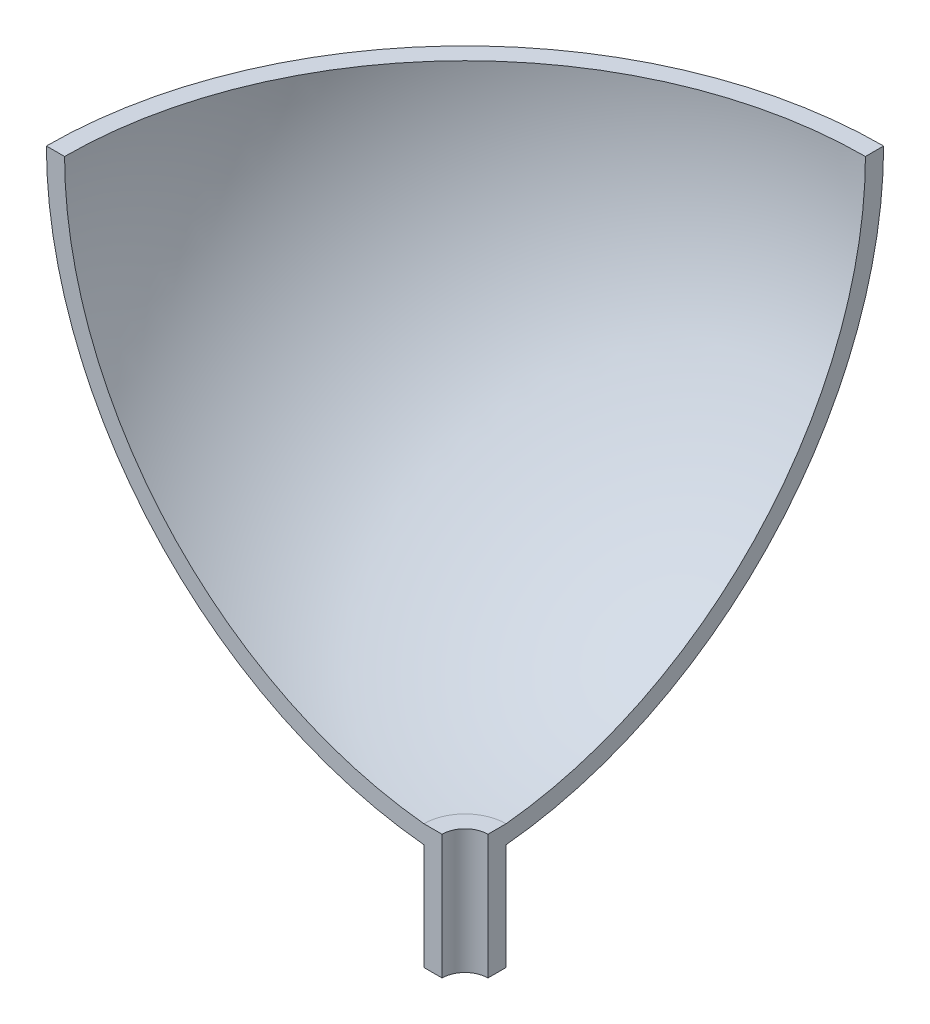
ISO-10303-21;
HEADER;
FILE_DESCRIPTION(('STEP AP214'),'2;1');
FILE_NAME('part.step','',(''),(''),'','','');
FILE_SCHEMA(('AUTOMOTIVE_DESIGN { 1 0 10303 214 1 1 1 1 }'));
ENDSEC;
DATA;
#1=APPLICATION_CONTEXT('core data for automotive mechanical design processes');
#2=APPLICATION_PROTOCOL_DEFINITION('international standard','automotive_design',2000,#1);
#3=PRODUCT_CONTEXT('',#1,'mechanical');
#4=PRODUCT('Part','Part','',(#3));
#5=PRODUCT_RELATED_PRODUCT_CATEGORY('part','',(#4));
#6=PRODUCT_DEFINITION_FORMATION('','',#4);
#7=PRODUCT_DEFINITION_CONTEXT('part definition',#1,'design');
#8=PRODUCT_DEFINITION('design','',#6,#7);
#9=PRODUCT_DEFINITION_SHAPE('','',#8);
#10=(LENGTH_UNIT() NAMED_UNIT(*) SI_UNIT(.MILLI.,.METRE.));
#11=(NAMED_UNIT(*) PLANE_ANGLE_UNIT() SI_UNIT($,.RADIAN.));
#12=(NAMED_UNIT(*) SI_UNIT($,.STERADIAN.) SOLID_ANGLE_UNIT());
#13=UNCERTAINTY_MEASURE_WITH_UNIT(LENGTH_MEASURE(1.E-05),#10,'distance_accuracy_value','');
#14=(GEOMETRIC_REPRESENTATION_CONTEXT(3) GLOBAL_UNCERTAINTY_ASSIGNED_CONTEXT((#13)) GLOBAL_UNIT_ASSIGNED_CONTEXT((#10,
#11,#12)) REPRESENTATION_CONTEXT('',''));
#15=CARTESIAN_POINT('',(0.,0.,0.));
#16=DIRECTION('',(0.,0.,1.));
#17=DIRECTION('',(1.,0.,0.));
#18=AXIS2_PLACEMENT_3D('',#15,#16,#17);
#19=CARTESIAN_POINT('',(-58.9055847390202,-50.2449558000892,-49.712739764208));
#20=CARTESIAN_POINT('',(-57.1857450467342,-50.3220090396217,-51.6724579386181));
#21=CARTESIAN_POINT('',(-55.4133865829986,-50.3653812390935,-53.5796913717649));
#22=CARTESIAN_POINT('',(-53.5740533404874,-50.3658015540345,-55.419993423271));
#23=CARTESIAN_POINT('',(-51.6677180650449,-50.3232525059646,-57.1933368566401));
#24=CARTESIAN_POINT('',(-49.7088412082021,-50.2470077894859,-58.9141727535752));
#25=CARTESIAN_POINT('',(-61.1016903577425,-45.4986884369503,-51.9087872304084));
#26=CARTESIAN_POINT('',(-59.3384090375767,-45.5478819385541,-53.8250919254778));
#27=CARTESIAN_POINT('',(-57.529846001576,-45.5680356274784,-55.696144245559));
#28=CARTESIAN_POINT('',(-55.6905016359395,-45.568448809,-57.5364351811472));
#29=CARTESIAN_POINT('',(-53.8203575703867,-45.5491097019948,-59.3459463738647));
#30=CARTESIAN_POINT('',(-51.9049206041925,-45.5007236093336,-61.1101940140349));
#31=CARTESIAN_POINT('',(-63.0217922628903,-40.5754159406518,-53.8290098230479));
#32=CARTESIAN_POINT('',(-61.2185045999578,-40.5989528018541,-55.7053340979543));
#33=CARTESIAN_POINT('',(-59.3952030568649,-40.6096544751637,-57.5616574609411));
#34=CARTESIAN_POINT('',(-57.5558336286948,-40.6100515837236,-59.4019233502351));
#35=CARTESIAN_POINT('',(-55.7004260500975,-40.6001631967906,-61.2261614812196));
#36=CARTESIAN_POINT('',(-53.8250194995491,-40.5774491828127,-63.0304135988337));
#37=CARTESIAN_POINT('',(-64.6609926945818,-35.4719973076584,-55.4685129558088));
#38=CARTESIAN_POINT('',(-62.857248392138,-35.4952413194044,-57.3443808870892));
#39=CARTESIAN_POINT('',(-61.0338585227858,-35.5058863478193,-59.2006159810486));
#40=CARTESIAN_POINT('',(-59.1945209026759,-35.5063038553436,-61.0409136577925));
#41=CARTESIAN_POINT('',(-57.3392035046148,-35.4964733024796,-62.8652419108795));
#42=CARTESIAN_POINT('',(-55.4642284316629,-35.4740360012622,-64.6699252265088));
#43=CARTESIAN_POINT('',(-66.0151267671325,-30.1857615371508,-56.8231344416957));
#44=CARTESIAN_POINT('',(-64.251774685789,-30.2349096585982,-58.7393684214379));
#45=CARTESIAN_POINT('',(-62.443860089913,-30.2554792014585,-60.6110687614792));
#46=CARTESIAN_POINT('',(-60.6045019640374,-30.2558835583416,-62.4513459457442));
#47=CARTESIAN_POINT('',(-58.7337311862224,-30.2361425317898,-64.2602308322855));
#48=CARTESIAN_POINT('',(-56.8184104928044,-30.1878310065247,-66.0245946698917));
#49=CARTESIAN_POINT('',(-67.096045099094,-24.7243086004753,-57.9047172205054));
#50=CARTESIAN_POINT('',(-65.3762818808082,-24.8014108838791,-59.8645118193635));
#51=CARTESIAN_POINT('',(-63.6018256900255,-24.8434377809617,-61.7696488847114));
#52=CARTESIAN_POINT('',(-61.7624653616699,-24.8438407253629,-63.6099238679236));
#53=CARTESIAN_POINT('',(-59.8582178887083,-24.8026306149158,-65.3853537509562));
#54=CARTESIAN_POINT('',(-57.8993004225248,-24.7263598550855,-67.106149064864));
#55=B_SPLINE_SURFACE_WITH_KNOTS('',5,5,((#19,#20,#21,#22,#23,#24),(#25,#26,#27,#28,#29,#30),
(#31,#32,#33,#34,#35,#36),(#37,#38,#39,#40,#41,#42),(#43,#44,#45,#46,#47,#48),(#49,#50,#51,#52,
#53,#54)),.UNSPECIFIED.,.F.,.F.,.F.,(6,6),(6,6),(-14.0000888690037,14.0266042001397),
(-6.50482985479459,6.5046461084925),.UNSPECIFIED.);
#56=CARTESIAN_POINT('',(-49.9130103250884,-50.0158336792259,-58.9379522964688));
#57=CARTESIAN_POINT('',(-50.0240145074251,-49.7740656418111,-59.0489565312698));
#58=CARTESIAN_POINT('',(-50.1342393521472,-49.5315818055488,-59.1591814225032));
#59=CARTESIAN_POINT('',(-50.3529714141401,-49.0455117182349,-59.3779135667376));
#60=CARTESIAN_POINT('',(-50.4614806748625,-48.8019273062662,-59.4864228632041));
#61=CARTESIAN_POINT('',(-50.6767797655258,-48.3136548694143,-59.7017220157917));
#62=CARTESIAN_POINT('',(-50.7835715268153,-48.0689685478308,-59.8085138032731));
#63=CARTESIAN_POINT('',(-50.9954339105249,-47.5784912882928,-60.0203762310213));
#64=CARTESIAN_POINT('',(-51.1005063483727,-47.3327019187355,-60.1254486867252));
#65=CARTESIAN_POINT('',(-51.3089283794986,-46.840017521427,-60.3338707464214));
#66=CARTESIAN_POINT('',(-51.4122796686318,-46.5931239285273,-60.437222046276));
#67=CARTESIAN_POINT('',(-51.6172577440387,-46.0982300794217,-60.6422001371626));
#68=CARTESIAN_POINT('',(-51.7188861029583,-45.8502311259873,-60.7438285008461));
#69=CARTESIAN_POINT('',(-51.9204167151636,-45.3531255800581,-60.9453591177594));
#70=CARTESIAN_POINT('',(-52.0203204143263,-45.1040201599343,-61.0452628168706));
#71=CARTESIAN_POINT('',(-52.2184001776931,-44.6047007488999,-61.2433425764128));
#72=CARTESIAN_POINT('',(-52.3165775575323,-44.3544878018378,-61.3415199524821));
#73=CARTESIAN_POINT('',(-52.5112032416356,-43.8529524579815,-61.536145626367));
#74=CARTESIAN_POINT('',(-52.6076527279297,-43.6016309786038,-61.6325951062145));
#75=CARTESIAN_POINT('',(-52.798821288963,-43.0978777542658,-61.8237636526531));
#76=CARTESIAN_POINT('',(-52.8935414088931,-42.8454468025967,-61.9184837644361));
#77=CARTESIAN_POINT('',(-53.0812500215578,-42.3394738907946,-62.1061923600058));
#78=CARTESIAN_POINT('',(-53.1742394195611,-42.0859326023563,-62.1991817490618));
#79=CARTESIAN_POINT('',(-53.3584855087849,-41.5777383570756,-62.3834278204042));
#80=CARTESIAN_POINT('',(-53.4497429624418,-41.3230859530847,-62.474685265127));
#81=CARTESIAN_POINT('',(-53.6305242351022,-40.8126689096288,-62.6554665206507));
#82=CARTESIAN_POINT('',(-53.7200486709932,-40.5569047071517,-62.7449909483385));
#83=CARTESIAN_POINT('',(-53.8973631475972,-40.0442636024467,-62.9223054098782));
#84=CARTESIAN_POINT('',(-53.9851536571473,-39.7873870245485,-63.0100959125666));
#85=CARTESIAN_POINT('',(-54.1589997034805,-39.272520817431,-63.183941947012));
#86=CARTESIAN_POINT('',(-54.2450555587851,-39.0145314033123,-63.2699977972901));
#87=CARTESIAN_POINT('',(-54.415431917527,-38.497439294792,-63.4403741481805));
#88=CARTESIAN_POINT('',(-54.4997525871621,-38.2383367099117,-63.5246948149904));
#89=CARTESIAN_POINT('',(-54.6666584094671,-37.7190181634119,-63.6916006340756));
#90=CARTESIAN_POINT('',(-54.7492435742806,-37.4588022095981,-63.7741857984943));
#91=CARTESIAN_POINT('',(-54.9126784513261,-36.9372569711716,-63.9376206772615));
#92=CARTESIAN_POINT('',(-54.9935280202133,-36.6759275967202,-64.0184702482655));
#93=CARTESIAN_POINT('',(-55.1534920147123,-36.1521557152424,-64.1784342494324));
#94=CARTESIAN_POINT('',(-55.2326061403726,-35.8897130250022,-64.2575483796443));
#95=CARTESIAN_POINT('',(-55.3890998180527,-35.3637148723399,-64.4140420686171));
#96=CARTESIAN_POINT('',(-55.4664789127292,-35.1001591377853,-64.4914211700354));
#97=CARTESIAN_POINT('',(-55.6195033737767,-34.5719354289426,-64.6444456463328));
#98=CARTESIAN_POINT('',(-55.6951481249773,-34.307267098234,-64.7200904060422));
#99=CARTESIAN_POINT('',(-55.8447050354469,-33.7768189114731,-64.8696473346847));
#100=CARTESIAN_POINT('',(-55.9186164216479,-33.5110386195039,-64.9435587305502));
#101=CARTESIAN_POINT('',(-56.0647080448347,-32.9783674164434,-65.0896503734117));
#102=CARTESIAN_POINT('',(-56.1368873511633,-32.7114759948746,-65.1618296897506));
#103=CARTESIAN_POINT('',(-56.2795165789487,-32.1765836405624,-65.3044589368839));
#104=CARTESIAN_POINT('',(-56.3499654128586,-31.9085821278443,-65.3749077801311));
#105=CARTESIAN_POINT('',(-56.4891357969873,-31.371470910809,-65.5140781810251));
#106=CARTESIAN_POINT('',(-56.5578561038707,-31.1023605621922,-65.5827984953353));
#107=CARTESIAN_POINT('',(-56.6935718873146,-30.5630332144632,-65.7185142902583));
#108=CARTESIAN_POINT('',(-56.7605659662627,-30.2928155119876,-65.785508373256));
#109=CARTESIAN_POINT('',(-56.8928321140922,-29.7512752291177,-65.9177745241065));
#110=CARTESIAN_POINT('',(-56.9581026330121,-29.4799518916261,-65.9830450419934));
#111=CARTESIAN_POINT('',(-57.0869248649362,-28.9362023525899,-66.1118672648205));
#112=CARTESIAN_POINT('',(-57.1504748779815,-28.6637753455904,-66.1754172697951));
#113=CARTESIAN_POINT('',(-57.2758596944785,-28.1178207330354,-66.3008020609094));
#114=CARTESIAN_POINT('',(-57.3376926507434,-27.8442922790681,-66.362634999853));
#115=CARTESIAN_POINT('',(-57.4596473829756,-27.2961372981332,-66.4845896857172));
#116=CARTESIAN_POINT('',(-57.5197671677502,-27.0215098851977,-66.5447094414322));
#117=CARTESIAN_POINT('',(-57.6382999383982,-26.4711597875789,-66.6632421394926));
#118=CARTESIAN_POINT('',(-57.6967107926083,-26.1954361847567,-66.7216529501575));
#119=CARTESIAN_POINT('',(-57.8118308095484,-25.642896773059,-66.8367728624344));
#120=CARTESIAN_POINT('',(-57.8685377045395,-25.3660800191871,-66.8934796962853));
#121=CARTESIAN_POINT('',(-57.9243582347104,-25.088906429198,-66.9493001550115));
#122=B_SPLINE_CURVE_WITH_KNOTS('',3,(#56,#57,#58,#59,#60,#61,#62,#63,#64,#65,#66,#67,#68,#69,
#70,#71,#72,#73,#74,#75,#76,#77,#78,#79,#80,#81,#82,#83,#84,#85,#86,#87,#88,#89,#90,#91,#92,#93,
#94,#95,#96,#97,#98,#99,#100,#101,#102,#103,#104,#105,#106,#107,#108,#109,#110,#111,#112,#113,
#114,#115,#116,#117,#118,#119,#120,#121),.UNSPECIFIED.,.F.,.F.,(4,2,2,2,2,2,2,2,2,2,2,2,2,2,2,2,
2,2,2,2,2,2,2,2,2,2,2,2,2,2,2,2,4),(0.,0.864786688565944,1.72845107828965,2.5910646772543,
3.45269949736901,4.31342804599675,5.17332331363659,6.03245875763974,6.89090828194839,
7.74874621285289,8.60604727077249,9.46288653807334,10.3193394229469,11.1754816193812,
12.0313890632671,12.8871378846926,13.7428043564863,14.598464839083,15.4541957217939,
16.3100733605735,17.1661740123853,18.0225737662782,18.8793484712952,19.7365736613441,
20.594324477169,21.4526755855705,22.3117010960285,23.1714744748902,24.0320684572916,
24.8935549569866,25.7560049742627,26.6194885021167,27.4840744309083),.UNSPECIFIED.);
#123=CARTESIAN_POINT('',(-49.9128168842235,-50.015709622826,-58.9377589809462));
#124=VERTEX_POINT('',#123);
#125=CARTESIAN_POINT('',(-57.9241253788509,-25.0887570949897,-66.9490674500338));
#126=VERTEX_POINT('',#125);
#127=EDGE_CURVE('E131',#124,#126,#122,.T.);
#128=CARTESIAN_POINT('',(-57.9243582348084,-25.0889064287122,-66.9493001551093));
#129=CARTESIAN_POINT('',(-58.1252942163154,-25.0887050982726,-66.7747300820743));
#130=CARTESIAN_POINT('',(-58.3255285439231,-25.0885630825879,-66.5993514342258));
#131=CARTESIAN_POINT('',(-58.7244597536622,-25.088368261401,-66.2470096548569));
#132=CARTESIAN_POINT('',(-58.9231572027319,-25.0883154212708,-66.0700471652075));
#133=CARTESIAN_POINT('',(-59.3189716812076,-25.0882694287908,-65.7144932161497));
#134=CARTESIAN_POINT('',(-59.5160892082541,-25.0882762568426,-65.5359023108515));
#135=CARTESIAN_POINT('',(-59.908705319142,-25.0883245460424,-65.1770558973588));
#136=CARTESIAN_POINT('',(-60.1042043273546,-25.0883659978017,-64.9968008535206));
#137=CARTESIAN_POINT('',(-60.493549063474,-25.0884622927992,-64.6345975260028));
#138=CARTESIAN_POINT('',(-60.6873951385027,-25.0885171331503,-64.4526496154962));
#139=CARTESIAN_POINT('',(-61.0734049906311,-25.0886233864266,-64.0870397068258));
#140=CARTESIAN_POINT('',(-61.2655690334307,-25.0886747999019,-63.9033779892094));
#141=CARTESIAN_POINT('',(-61.6481917462828,-25.0887619874963,-63.5343273548842));
#142=CARTESIAN_POINT('',(-61.8386505966893,-25.0887977632888,-63.3489386251727));
#143=CARTESIAN_POINT('',(-62.2178464108267,-25.0888462779537,-62.9764286231511));
#144=CARTESIAN_POINT('',(-62.406583466168,-25.088859018059,-62.7893074440981));
#145=CARTESIAN_POINT('',(-62.7823262098473,-25.0888589853955,-62.413334829901));
#146=CARTESIAN_POINT('',(-62.9693318984264,-25.0888462126303,-62.2244833949979));
#147=CARTESIAN_POINT('',(-63.3416098249436,-25.0887976386681,-61.8450599440906));
#148=CARTESIAN_POINT('',(-63.5268819700546,-25.0887618362449,-61.6544878370102));
#149=CARTESIAN_POINT('',(-63.8956983609199,-25.0886746067217,-61.2716397390136));
#150=CARTESIAN_POINT('',(-64.0792424200554,-25.0886231779536,-61.0793635683283));
#151=CARTESIAN_POINT('',(-64.4446159599143,-25.0885169093392,-60.6931305872817));
#152=CARTESIAN_POINT('',(-64.6264451604165,-25.0884620689461,-60.4991735118541));
#153=CARTESIAN_POINT('',(-64.9884100393402,-25.088365791075,-60.109607892405));
#154=CARTESIAN_POINT('',(-65.1685453448611,-25.0883243564841,-59.9139990019397));
#155=CARTESIAN_POINT('',(-65.5271512760949,-25.0882761183599,-59.521164225846));
#156=CARTESIAN_POINT('',(-65.705621437667,-25.0882693242106,-59.3239379165634));
#157=CARTESIAN_POINT('',(-66.0609329155872,-25.0883153983034,-58.9279069463786));
#158=CARTESIAN_POINT('',(-66.2377736779789,-25.0883682861324,-58.7291017885849));
#159=CARTESIAN_POINT('',(-66.5898710388328,-25.088563210336,-58.3299561971163));
#160=CARTESIAN_POINT('',(-66.7651269955091,-25.0887052813186,-58.1296151972756));
#161=CARTESIAN_POINT('',(-66.9395739542035,-25.0889066677563,-57.9285730419037));
#162=B_SPLINE_CURVE_WITH_KNOTS('',3,(#128,#129,#130,#131,#132,#133,#134,#135,#136,#137,#138,
#139,#140,#141,#142,#143,#144,#145,#146,#147,#148,#149,#150,#151,#152,#153,#154,#155,#156,#157,
#158,#159,#160,#161),.UNSPECIFIED.,.F.,.F.,(4,2,2,2,2,2,2,2,2,2,2,2,2,2,2,2,4),(0.,
0.798528704072951,1.59674725920317,2.39470364656522,3.19244372753969,3.99001193670427,
4.78745179908138,5.58480629738741,6.38211812106641,7.17942983372785,7.97678399897745,
8.77422330635641,9.57179073908994,10.3695298235914,11.1674849972731,11.9657021263599,
12.7642291993522),.UNSPECIFIED.);
#163=CARTESIAN_POINT('',(-66.9393409118987,-25.0887572143967,-57.9283401506017));
#164=VERTEX_POINT('',#163);
#165=EDGE_CURVE('E14',#126,#164,#162,.T.);
#166=CARTESIAN_POINT('',(-66.9395739542012,-25.0889066677668,-57.9285730419017));
#167=CARTESIAN_POINT('',(-66.8837504963645,-25.3660811144671,-57.87274965568));
#168=CARTESIAN_POINT('',(-66.8270407077765,-25.6428987217692,-57.8160399283543));
#169=CARTESIAN_POINT('',(-66.7119149269729,-26.1954398550985,-57.7009142523853));
#170=CARTESIAN_POINT('',(-66.6535012022088,-26.4711643260468,-57.6425005712159));
#171=CARTESIAN_POINT('',(-66.5349626742303,-27.0215161500228,-57.5239621158766));
#172=CARTESIAN_POINT('',(-66.4748400024922,-27.2961444211504,-57.4638394732001));
#173=CARTESIAN_POINT('',(-66.35287945009,-27.8443010890465,-57.3418789671413));
#174=CARTESIAN_POINT('',(-66.2910435604966,-28.1178303717682,-57.2800430948428));
#175=CARTESIAN_POINT('',(-66.1656528070015,-28.663786596935,-57.1546523666635));
#176=CARTESIAN_POINT('',(-66.1020997902039,-28.9362143877914,-57.0910993578964));
#177=CARTESIAN_POINT('',(-65.9732714622387,-29.4799654378893,-56.9622710389455));
#178=CARTESIAN_POINT('',(-65.907997850965,-29.7512895025909,-56.8969974286621));
#179=CARTESIAN_POINT('',(-65.7757254166671,-30.2928311746856,-56.7647249912634));
#180=CARTESIAN_POINT('',(-65.7087281435402,-30.5630495391788,-56.6977277140498));
#181=CARTESIAN_POINT('',(-65.5730058610824,-31.1023781399834,-56.5620054200495));
#182=CARTESIAN_POINT('',(-65.5042822492881,-31.3714890796522,-56.4932818008021));
#183=CARTESIAN_POINT('',(-65.3651051394422,-31.9086014044211,-56.3541046741515));
#184=CARTESIAN_POINT('',(-65.2946528846294,-32.1766034338008,-56.2836524099886));
#185=CARTESIAN_POINT('',(-65.1520166969411,-32.7114967456114,-56.141016202941));
#186=CARTESIAN_POINT('',(-65.0798338514895,-32.9783886079788,-56.0688333474804));
#187=CARTESIAN_POINT('',(-64.9337350322079,-33.5110606169377,-55.9227345085407));
#188=CARTESIAN_POINT('',(-64.8598199888822,-33.7768412739472,-55.8488194555655));
#189=CARTESIAN_POINT('',(-64.7102556484634,-34.3072901164431,-55.6992550970155));
#190=CARTESIAN_POINT('',(-64.6346071242543,-34.5719587377637,-55.6236065643242));
#191=CARTESIAN_POINT('',(-64.4815750050236,-35.1001829557353,-55.4705744299056));
#192=CARTESIAN_POINT('',(-64.4041920249579,-35.3637389086998,-55.3931914431335));
#193=CARTESIAN_POINT('',(-64.2476904687738,-35.8897374289263,-55.2366898757326));
#194=CARTESIAN_POINT('',(-64.168572349755,-36.1521802681896,-55.1575717522028));
#195=CARTESIAN_POINT('',(-64.0086002657163,-36.6759523816017,-54.9975996615789));
#196=CARTESIAN_POINT('',(-63.9277466003776,-36.9372818388088,-54.9167459941656));
#197=CARTESIAN_POINT('',(-63.7643034325632,-37.4588271798208,-54.7533028247112));
#198=CARTESIAN_POINT('',(-63.6817140731383,-37.7190431532849,-54.6707134657209));
#199=CARTESIAN_POINT('',(-63.5147997683818,-38.2383616791469,-54.5037991642578));
#200=CARTESIAN_POINT('',(-63.4304748105918,-38.4974642235365,-54.4194742093268));
#201=CARTESIAN_POINT('',(-63.2600897862903,-39.0145561937075,-54.2490891929352));
#202=CARTESIAN_POINT('',(-63.1740295532479,-39.2725455097427,-54.1630289649441));
#203=CARTESIAN_POINT('',(-63.0001746652058,-39.787411465284,-53.9891740888275));
#204=CARTESIAN_POINT('',(-62.9123796913354,-40.0442878894425,-53.9013791218317));
#205=CARTESIAN_POINT('',(-62.7350562016412,-40.5569286324313,-53.7240556472146));
#206=CARTESIAN_POINT('',(-62.6455272166163,-40.8126926266633,-53.6345266703923));
#207=CARTESIAN_POINT('',(-62.4647367615549,-41.3231091996266,-53.4537362324527));
#208=CARTESIAN_POINT('',(-62.3734746742522,-41.577761341079,-53.3624741540693));
#209=CARTESIAN_POINT('',(-62.1892192322503,-42.0859550064477,-53.1782187299055));
#210=CARTESIAN_POINT('',(-62.0962251147205,-42.339495977198,-53.0852246212946));
#211=CARTESIAN_POINT('',(-61.9085069743255,-42.8454681967796,-52.8975064979248));
#212=CARTESIAN_POINT('',(-61.8137820457802,-43.0978987735761,-52.8027815774855));
#213=CARTESIAN_POINT('',(-61.622603773676,-43.6016511880533,-52.6116033198841));
#214=CARTESIAN_POINT('',(-61.5261493844951,-43.8529722320739,-52.5151489370988));
#215=CARTESIAN_POINT('',(-61.3315137935413,-44.3545066405011,-52.3205133562561));
#216=CARTESIAN_POINT('',(-61.233331409283,-44.6047190870894,-52.2223309757113));
#217=CARTESIAN_POINT('',(-61.0352415266247,-45.1040374264912,-52.0242410967644));
#218=CARTESIAN_POINT('',(-60.9353327121044,-45.3531422750157,-51.9243322822391));
#219=CARTESIAN_POINT('',(-60.7337917471777,-45.8502465996979,-51.722791312498));
#220=CARTESIAN_POINT('',(-60.6321581503735,-46.098244902999,-51.62115771088));
#221=CARTESIAN_POINT('',(-60.4271694634589,-46.5931373650284,-51.4161690084014));
#222=CARTESIAN_POINT('',(-60.3238128001388,-46.8400302204467,-51.312812334325));
#223=CARTESIAN_POINT('',(-60.1153798690256,-47.3327130458551,-51.1043793745971));
#224=CARTESIAN_POINT('',(-60.0103019047619,-47.5785015803932,-50.9993013924674));
#225=CARTESIAN_POINT('',(-59.7984282986307,-48.0689770614588,-50.7874277423138));
#226=CARTESIAN_POINT('',(-59.6916308406592,-48.3136624389162,-50.6806302581766));
#227=CARTESIAN_POINT('',(-59.47632016714,-48.80193286643,-50.4653195228333));
#228=CARTESIAN_POINT('',(-59.3678050194977,-49.0455162124301,-50.3568043395211));
#229=CARTESIAN_POINT('',(-59.1490609721757,-49.5315840324149,-50.138060210168));
#230=CARTESIAN_POINT('',(-59.0388300282189,-49.774066666464,-50.0278292198362));
#231=CARTESIAN_POINT('',(-58.9278196574995,-50.0158333763347,-49.9168187968265));
#232=B_SPLINE_CURVE_WITH_KNOTS('',3,(#166,#167,#168,#169,#170,#171,#172,#173,#174,#175,#176,
#177,#178,#179,#180,#181,#182,#183,#184,#185,#186,#187,#188,#189,#190,#191,#192,#193,#194,#195,
#196,#197,#198,#199,#200,#201,#202,#203,#204,#205,#206,#207,#208,#209,#210,#211,#212,#213,#214,
#215,#216,#217,#218,#219,#220,#221,#222,#223,#224,#225,#226,#227,#228,#229,#230,#231),
.UNSPECIFIED.,.F.,.F.,(4,2,2,2,2,2,2,2,2,2,2,2,2,2,2,2,2,2,2,2,2,2,2,2,2,2,2,2,2,2,2,2,4),(0.,
0.864591804058777,1.72808132221831,2.59053742086477,3.45203007770357,4.31263028482108,
5.17240995345081,6.03144182062855,6.8897993579154,7.74755668236354,8.60478846989276,
9.46156987124003,10.317976430637,11.1740840073626,12.0299687003106,12.8857067757012,
13.7413745980611,14.5970485645809,15.4528050429561,16.3087203128016,17.1648705107252,
18.0213315791307,18.878179218816,19.7354888454159,20.5933355497351,21.4517940620024,
22.3109387200703,23.1708434415731,24.0315817000495,24.8932265050241,25.7558503860338,
26.6195253805714,27.4843230259441),.UNSPECIFIED.);
#233=CARTESIAN_POINT('',(-58.9276264527723,-50.0157094713795,-49.9166257172888));
#234=VERTEX_POINT('',#233);
#235=EDGE_CURVE('E118',#164,#234,#232,.T.);
#236=CARTESIAN_POINT('',(-58.9278196574988,-50.015833376336,-49.9168187968261));
#237=CARTESIAN_POINT('',(-58.755419853302,-50.0156764598829,-50.1199626618818));
#238=CARTESIAN_POINT('',(-58.5820478483884,-50.0155670912133,-50.3222822737349));
#239=CARTESIAN_POINT('',(-58.2334401729591,-50.0154178259842,-50.7250952049181));
#240=CARTESIAN_POINT('',(-58.058205694256,-50.0153778874063,-50.925589555739));
#241=CARTESIAN_POINT('',(-57.7058442394387,-50.0153417412332,-51.3247080130437));
#242=CARTESIAN_POINT('',(-57.5287183831371,-50.0153455090555,-51.5233331079744));
#243=CARTESIAN_POINT('',(-57.1725525676258,-50.0153773671623,-51.9186802818867));
#244=CARTESIAN_POINT('',(-56.9935136077286,-50.0154054453083,-52.1154032610732));
#245=CARTESIAN_POINT('',(-56.6335034865665,-50.0154704542231,-52.5069212779928));
#246=CARTESIAN_POINT('',(-56.4525331661686,-50.0155073812785,-52.7017170888631));
#247=CARTESIAN_POINT('',(-56.0886463083522,-50.0155786033999,-53.0893631306769));
#248=CARTESIAN_POINT('',(-55.9057304238637,-50.0156128993191,-53.2822139744993));
#249=CARTESIAN_POINT('',(-55.5379421325703,-50.015670881668,-53.6659586291862));
#250=CARTESIAN_POINT('',(-55.3530701702477,-50.0156945704572,-53.8568528660356));
#251=CARTESIAN_POINT('',(-54.9813632083336,-50.0157266573174,-54.2366782802713));
#252=CARTESIAN_POINT('',(-54.7945284329278,-50.0157350571159,-54.4256096770478));
#253=CARTESIAN_POINT('',(-54.4188932748963,-50.0157350236548,-54.8015081550276));
#254=CARTESIAN_POINT('',(-54.2300928927166,-50.0157265903989,-54.9884752366769));
#255=CARTESIAN_POINT('',(-53.8505282261638,-50.0156944407285,-55.3604481097784));
#256=CARTESIAN_POINT('',(-53.6597637231261,-50.0156707225938,-55.5454536780993));
#257=CARTESIAN_POINT('',(-53.2762772682446,-50.0156126898675,-55.9135104851121));
#258=CARTESIAN_POINT('',(-53.083554890977,-50.015578372923,-56.0965612805294));
#259=CARTESIAN_POINT('',(-52.6961645307997,-50.0155071214466,-56.4607192657093));
#260=CARTESIAN_POINT('',(-52.5014959354155,-50.0154701860668,-56.6418258038885));
#261=CARTESIAN_POINT('',(-52.1102311169627,-50.0154051777895,-57.0021096642214));
#262=CARTESIAN_POINT('',(-51.9136341210179,-50.0153771086088,-57.1812861469735));
#263=CARTESIAN_POINT('',(-51.5185377028253,-50.0153452904743,-57.5377283054294));
#264=CARTESIAN_POINT('',(-51.3200373805092,-50.0153415536592,-57.7149929833797));
#265=CARTESIAN_POINT('',(-50.9211672816214,-50.0153777887332,-58.0676333674061));
#266=CARTESIAN_POINT('',(-50.7207965166387,-50.0154177852003,-58.2430079552921));
#267=CARTESIAN_POINT('',(-50.3182295983568,-50.0155671976074,-58.5918971158469));
#268=CARTESIAN_POINT('',(-50.1160324135306,-50.0156766555536,-58.7654104983503));
#269=CARTESIAN_POINT('',(-49.9130103250929,-50.0158336792162,-58.9379522964732));
#270=B_SPLINE_CURVE_WITH_KNOTS('',3,(#236,#237,#238,#239,#240,#241,#242,#243,#244,#245,#246,
#247,#248,#249,#250,#251,#252,#253,#254,#255,#256,#257,#258,#259,#260,#261,#262,#263,#264,#265,
#266,#267,#268,#269),.UNSPECIFIED.,.F.,.F.,(4,2,2,2,2,2,2,2,2,2,2,2,2,2,2,2,4),(0.,
0.799311481699423,1.59813905757843,2.39651735507522,3.19449723480012,3.9921428213249,
4.78952867273285,5.58673706639499,6.38385537471945,7.1809735021336,7.97818135304152,
8.77556629978626,9.57321061965204,10.3711888706665,11.1695651774913,11.9683904011893,
12.7676991703865),.UNSPECIFIED.);
#271=EDGE_CURVE('E134',#234,#124,#270,.T.);
#272=ORIENTED_EDGE('',*,*,#127,.T.);
#273=ORIENTED_EDGE('',*,*,#165,.T.);
#274=ORIENTED_EDGE('',*,*,#235,.T.);
#275=ORIENTED_EDGE('',*,*,#271,.T.);
#276=EDGE_LOOP('',(#272,#273,#274,#275));
#277=FACE_BOUND('',#276,.T.);
#278=ADVANCED_FACE('F67',(#277),#55,.F.);
#279=CARTESIAN_POINT('',(-57.9238925229428,-25.0886077610243,-66.9488347450076));
#280=DIRECTION('',(-0.707106781186533,0.,0.707106781186562));
#281=DIRECTION('',(0.707106781186562,0.,0.707106781186533));
#282=AXIS2_PLACEMENT_3D('',#279,#280,#281);
#283=PLANE('',#282);
#284=DIRECTION('',(0.,-1.,0.));
#285=VECTOR('',#284,1.);
#286=CARTESIAN_POINT('',(-49.9126234433572,-50.0155855664309,-58.9375656654223));
#287=LINE('',#286,#285);
#288=CARTESIAN_POINT('',(-49.9126234433572,-155.088757094989,-58.9375656654223));
#289=VERTEX_POINT('',#288);
#290=EDGE_CURVE('E126',#124,#289,#287,.T.);
#291=ORIENTED_EDGE('',*,*,#290,.T.);
#292=DIRECTION('',(-0.707106781186562,0.,-0.707106781186533));
#293=VECTOR('',#292,1.);
#294=CARTESIAN_POINT('',(-57.9238925229428,-155.088757094989,-66.9488347450076));
#295=LINE('',#294,#293);
#296=CARTESIAN_POINT('',(-57.9240179132122,-155.08875709499,-66.9489433373106));
#297=VERTEX_POINT('',#296);
#298=EDGE_CURVE('E112',#289,#297,#295,.T.);
#299=ORIENTED_EDGE('',*,*,#298,.T.);
#300=DIRECTION('',(0.,-1.,0.));
#301=VECTOR('',#300,1.);
#302=CARTESIAN_POINT('',(-57.9238925229428,-25.0886077610243,-66.9488347450076));
#303=LINE('',#302,#301);
#304=EDGE_CURVE('E123',#126,#297,#303,.T.);
#305=ORIENTED_EDGE('',*,*,#304,.F.);
#306=ORIENTED_EDGE('',*,*,#127,.F.);
#307=EDGE_LOOP('',(#291,#299,#305,#306));
#308=FACE_BOUND('',#307,.T.);
#309=ADVANCED_FACE('F122',(#308),#283,.F.);
#310=CARTESIAN_POINT('',(0.0451473242549794,-50.0155855664309,0.));
#311=DIRECTION('',(0.,-1.,0.));
#312=DIRECTION('',(0.,0.,-1.));
#313=AXIS2_PLACEMENT_3D('',#310,#311,#312);
#314=CYLINDRICAL_SURFACE('',#313,77.2619926395589);
#315=DIRECTION('',(0.,-1.,0.));
#316=VECTOR('',#315,1.);
#317=CARTESIAN_POINT('',(-58.9274332480463,-50.01558556642,-49.916432637752));
#318=LINE('',#317,#316);
#319=CARTESIAN_POINT('',(-58.9274332480463,-155.088757094989,-49.916432637752));
#320=VERTEX_POINT('',#319);
#321=EDGE_CURVE('E130',#234,#320,#318,.T.);
#322=ORIENTED_EDGE('',*,*,#321,.T.);
#323=CARTESIAN_POINT('',(0.0451473242549794,-155.088757094989,0.));
#324=DIRECTION('',(0.,1.,0.));
#325=DIRECTION('',(0.,0.,1.));
#326=AXIS2_PLACEMENT_3D('',#323,#324,#325);
#327=CIRCLE('',#326,77.2619926395589);
#328=EDGE_CURVE('E127',#320,#289,#327,.F.);
#329=ORIENTED_EDGE('',*,*,#328,.T.);
#330=ORIENTED_EDGE('',*,*,#290,.F.);
#331=ORIENTED_EDGE('',*,*,#271,.F.);
#332=EDGE_LOOP('',(#322,#329,#330,#331));
#333=FACE_BOUND('',#332,.T.);
#334=ADVANCED_FACE('F162',(#333),#314,.F.);
#335=CARTESIAN_POINT('',(-58.9274332480463,-50.01558556642,-49.916432637752));
#336=DIRECTION('',(0.707106781186549,0.,-0.707106781186546));
#337=DIRECTION('',(-0.707106781186546,0.,-0.707106781186549));
#338=AXIS2_PLACEMENT_3D('',#335,#336,#337);
#339=PLANE('',#338);
#340=DIRECTION('',(0.,-1.,0.));
#341=VECTOR('',#340,1.);
#342=CARTESIAN_POINT('',(-66.9391078695947,-25.0886077610355,-57.9281072593004));
#343=LINE('',#342,#341);
#344=CARTESIAN_POINT('',(-66.9392166337793,-155.088757154693,-57.928232674597));
#345=VERTEX_POINT('',#344);
#346=EDGE_CURVE('E142',#164,#345,#343,.T.);
#347=ORIENTED_EDGE('',*,*,#346,.T.);
#348=DIRECTION('',(0.707106781186546,0.,0.707106781186549));
#349=VECTOR('',#348,1.);
#350=CARTESIAN_POINT('',(-58.9274332480463,-155.088757094989,-49.916432637752));
#351=LINE('',#350,#349);
#352=EDGE_CURVE('E115',#345,#320,#351,.T.);
#353=ORIENTED_EDGE('',*,*,#352,.T.);
#354=ORIENTED_EDGE('',*,*,#321,.F.);
#355=ORIENTED_EDGE('',*,*,#235,.F.);
#356=EDGE_LOOP('',(#347,#353,#354,#355));
#357=FACE_BOUND('',#356,.T.);
#358=ADVANCED_FACE('F157',(#357),#339,.F.);
#359=CARTESIAN_POINT('',(0.0451473242549794,-25.0886077610355,0.));
#360=DIRECTION('',(0.,-1.,0.));
#361=DIRECTION('',(0.,0.,-1.));
#362=AXIS2_PLACEMENT_3D('',#359,#360,#361);
#363=CYLINDRICAL_SURFACE('',#362,88.5582071550687);
#364=CARTESIAN_POINT('',(0.0451473242549794,-155.088607761024,0.));
#365=DIRECTION('',(0.,1.,0.));
#366=DIRECTION('',(-0.65458687240236,0.,-0.75598678988359));
#367=AXIS2_PLACEMENT_3D('',#364,#365,#366);
#368=CIRCLE('',#367,88.5582071550687);
#369=EDGE_CURVE('E81',#297,#345,#368,.T.);
#370=ORIENTED_EDGE('',*,*,#369,.T.);
#371=ORIENTED_EDGE('',*,*,#346,.F.);
#372=ORIENTED_EDGE('',*,*,#165,.F.);
#373=ORIENTED_EDGE('',*,*,#304,.T.);
#374=EDGE_LOOP('',(#370,#371,#372,#373));
#375=FACE_BOUND('',#374,.T.);
#376=ADVANCED_FACE('F129',(#375),#363,.T.);
#377=CARTESIAN_POINT('',(0.,-155.088757094989,0.));
#378=DIRECTION('',(0.,1.,0.));
#379=DIRECTION('',(0.,0.,1.));
#380=AXIS2_PLACEMENT_3D('',#377,#378,#379);
#381=PLANE('',#380);
#382=ORIENTED_EDGE('',*,*,#328,.F.);
#383=ORIENTED_EDGE('',*,*,#352,.F.);
#384=ORIENTED_EDGE('',*,*,#369,.F.);
#385=ORIENTED_EDGE('',*,*,#298,.F.);
#386=EDGE_LOOP('',(#382,#383,#384,#385));
#387=FACE_BOUND('',#386,.T.);
#388=ADVANCED_FACE('F111',(#387),#381,.F.);
#389=CLOSED_SHELL('',(#278,#309,#334,#358,#376,#388));
#390=MANIFOLD_SOLID_BREP('B2',#389);
#391=CARTESIAN_POINT('',(0.0451473242549794,0.,0.));
#392=DIRECTION('',(0.,1.,0.));
#393=DIRECTION('',(0.,0.,1.));
#394=AXIS2_PLACEMENT_3D('',#391,#392,#393);
#395=DEGENERATE_TOROIDAL_SURFACE('',#394,0.0451473242549794,92.,.T.);
#396=CARTESIAN_POINT('',(0.0451473242549794,0.,0.));
#397=DIRECTION('',(0.,1.,0.));
#398=DIRECTION('',(0.,0.,1.));
#399=AXIS2_PLACEMENT_3D('',#396,#397,#398);
#400=CIRCLE('',#399,92.045147324255);
#401=CARTESIAN_POINT('',(0.0451473242553007,0.,-92.045147324255));
#402=VERTEX_POINT('',#401);
#403=CARTESIAN_POINT('',(-92.,0.,0.));
#404=VERTEX_POINT('',#403);
#405=EDGE_CURVE('E65',#402,#404,#400,.T.);
#406=ORIENTED_EDGE('',*,*,#405,.F.);
#407=CARTESIAN_POINT('',(0.0451473242549795,0.,-0.0451473242549794));
#408=DIRECTION('',(-1.,0.,0.));
#409=DIRECTION('',(0.,0.,-1.));
#410=AXIS2_PLACEMENT_3D('',#407,#408,#409);
#411=CIRCLE('',#410,92.);
#412=CARTESIAN_POINT('',(0.0451473242550109,-91.5589515174451,-9.04283575107499));
#413=VERTEX_POINT('',#412);
#414=EDGE_CURVE('E363',#402,#413,#411,.T.);
#415=ORIENTED_EDGE('',*,*,#414,.T.);
#416=CARTESIAN_POINT('',(0.0451473242549794,-91.5589515174451,0.));
#417=DIRECTION('',(0.,1.,0.));
#418=DIRECTION('',(0.,0.,1.));
#419=AXIS2_PLACEMENT_3D('',#416,#417,#418);
#420=CIRCLE('',#419,9.04283575107499);
#421=CARTESIAN_POINT('',(-8.99768842682001,-91.5589515174451,0.));
#422=VERTEX_POINT('',#421);
#423=EDGE_CURVE('E358',#413,#422,#420,.T.);
#424=ORIENTED_EDGE('',*,*,#423,.T.);
#425=CARTESIAN_POINT('',(0.,0.,0.));
#426=DIRECTION('',(0.,0.,1.));
#427=DIRECTION('',(-1.,0.,0.));
#428=AXIS2_PLACEMENT_3D('',#425,#426,#427);
#429=CIRCLE('',#428,92.);
#430=EDGE_CURVE('E361',#404,#422,#429,.T.);
#431=ORIENTED_EDGE('',*,*,#430,.F.);
#432=EDGE_LOOP('',(#406,#415,#424,#431));
#433=FACE_BOUND('',#432,.T.);
#434=ADVANCED_FACE('F304',(#433),#395,.T.);
#435=CARTESIAN_POINT('',(0.0451473242553007,0.,-92.045147324255));
#436=DIRECTION('',(0.,1.,0.));
#437=DIRECTION('',(0.,0.,1.));
#438=AXIS2_PLACEMENT_3D('',#435,#436,#437);
#439=PLANE('',#438);
#440=CARTESIAN_POINT('',(0.0451473242549794,0.,0.));
#441=DIRECTION('',(0.,1.,0.));
#442=DIRECTION('',(0.,0.,1.));
#443=AXIS2_PLACEMENT_3D('',#440,#441,#442);
#444=CIRCLE('',#443,88.045147324255);
#445=CARTESIAN_POINT('',(0.0451473242552868,0.,-88.045147324255));
#446=VERTEX_POINT('',#445);
#447=CARTESIAN_POINT('',(-88.,0.,0.));
#448=VERTEX_POINT('',#447);
#449=EDGE_CURVE('E312',#446,#448,#444,.T.);
#450=ORIENTED_EDGE('',*,*,#449,.F.);
#451=DIRECTION('',(0.,0.,-1.));
#452=VECTOR('',#451,1.);
#453=CARTESIAN_POINT('',(0.0451473242553007,0.,-92.045147324255));
#454=LINE('',#453,#452);
#455=EDGE_CURVE('E368',#446,#402,#454,.T.);
#456=ORIENTED_EDGE('',*,*,#455,.T.);
#457=ORIENTED_EDGE('',*,*,#405,.T.);
#458=DIRECTION('',(-1.,0.,0.));
#459=VECTOR('',#458,1.);
#460=CARTESIAN_POINT('',(-92.,0.,0.));
#461=LINE('',#460,#459);
#462=EDGE_CURVE('E381',#448,#404,#461,.T.);
#463=ORIENTED_EDGE('',*,*,#462,.F.);
#464=EDGE_LOOP('',(#450,#456,#457,#463));
#465=FACE_BOUND('',#464,.T.);
#466=ADVANCED_FACE('F306',(#465),#439,.T.);
#467=CARTESIAN_POINT('',(0.0451473242549794,0.0205866906356073,0.));
#468=DIRECTION('',(0.,1.,0.));
#469=DIRECTION('',(0.,0.,-1.));
#470=AXIS2_PLACEMENT_3D('',#467,#468,#469);
#471=SPHERICAL_SURFACE('',#470,88.0451497310419);
#472=CARTESIAN_POINT('',(0.0451473242549794,-87.5589515174451,0.));
#473=DIRECTION('',(0.,1.,0.));
#474=DIRECTION('',(0.,0.,1.));
#475=AXIS2_PLACEMENT_3D('',#472,#473,#474);
#476=CIRCLE('',#475,9.04283575107501);
#477=CARTESIAN_POINT('',(0.0451473242550109,-87.5589515174451,-9.04283575107501));
#478=VERTEX_POINT('',#477);
#479=CARTESIAN_POINT('',(-8.99768842682003,-87.5589515174451,0.));
#480=VERTEX_POINT('',#479);
#481=EDGE_CURVE('E414',#478,#480,#476,.T.);
#482=ORIENTED_EDGE('',*,*,#481,.F.);
#483=CARTESIAN_POINT('',(0.0451473242549794,0.0205866906356073,0.));
#484=DIRECTION('',(1.,0.,0.));
#485=DIRECTION('',(0.,0.,1.));
#486=AXIS2_PLACEMENT_3D('',#483,#484,#485);
#487=CIRCLE('',#486,88.0451497310419);
#488=EDGE_CURVE('E406',#478,#446,#487,.T.);
#489=ORIENTED_EDGE('',*,*,#488,.T.);
#490=ORIENTED_EDGE('',*,*,#449,.T.);
#491=CARTESIAN_POINT('',(0.0451473242549794,0.0205866906356073,0.));
#492=DIRECTION('',(0.,0.,-1.));
#493=DIRECTION('',(1.,0.,0.));
#494=AXIS2_PLACEMENT_3D('',#491,#492,#493);
#495=CIRCLE('',#494,88.0451497310419);
#496=EDGE_CURVE('E391',#480,#448,#495,.T.);
#497=ORIENTED_EDGE('',*,*,#496,.F.);
#498=EDGE_LOOP('',(#482,#489,#490,#497));
#499=FACE_BOUND('',#498,.T.);
#500=ADVANCED_FACE('F417',(#499),#471,.F.);
#501=CARTESIAN_POINT('',(0.045147324254997,-87.5589515174451,-5.04283575107498));
#502=DIRECTION('',(0.,1.,0.));
#503=DIRECTION('',(0.,0.,1.));
#504=AXIS2_PLACEMENT_3D('',#501,#502,#503);
#505=PLANE('',#504);
#506=CARTESIAN_POINT('',(0.0451473242549794,-87.5589515174451,0.));
#507=DIRECTION('',(0.,1.,0.));
#508=DIRECTION('',(0.,0.,1.));
#509=AXIS2_PLACEMENT_3D('',#506,#507,#508);
#510=CIRCLE('',#509,5.04283575107498);
#511=CARTESIAN_POINT('',(0.045147324254997,-87.5589515174451,-5.04283575107498));
#512=VERTEX_POINT('',#511);
#513=CARTESIAN_POINT('',(-4.99768842682001,-87.5589515174451,0.));
#514=VERTEX_POINT('',#513);
#515=EDGE_CURVE('E412',#512,#514,#510,.T.);
#516=ORIENTED_EDGE('',*,*,#515,.F.);
#517=DIRECTION('',(0.,0.,-1.));
#518=VECTOR('',#517,1.);
#519=CARTESIAN_POINT('',(0.045147324254997,-87.5589515174451,-5.04283575107498));
#520=LINE('',#519,#518);
#521=EDGE_CURVE('E403',#512,#478,#520,.T.);
#522=ORIENTED_EDGE('',*,*,#521,.T.);
#523=ORIENTED_EDGE('',*,*,#481,.T.);
#524=DIRECTION('',(-1.,0.,0.));
#525=VECTOR('',#524,1.);
#526=CARTESIAN_POINT('',(-4.99768842682001,-87.5589515174451,0.));
#527=LINE('',#526,#525);
#528=EDGE_CURVE('E388',#514,#480,#527,.T.);
#529=ORIENTED_EDGE('',*,*,#528,.F.);
#530=EDGE_LOOP('',(#516,#522,#523,#529));
#531=FACE_BOUND('',#530,.T.);
#532=ADVANCED_FACE('F432',(#531),#505,.T.);
#533=CARTESIAN_POINT('',(0.0451473242549794,0.0205866906356073,0.));
#534=DIRECTION('',(0.,1.,0.));
#535=DIRECTION('',(0.,0.,1.));
#536=AXIS2_PLACEMENT_3D('',#533,#534,#535);
#537=CYLINDRICAL_SURFACE('',#536,5.04283575107498);
#538=CARTESIAN_POINT('',(0.0451473242549794,-114.93680751876,0.));
#539=DIRECTION('',(0.,1.,0.));
#540=DIRECTION('',(0.,0.,1.));
#541=AXIS2_PLACEMENT_3D('',#538,#539,#540);
#542=CIRCLE('',#541,5.04283575107498);
#543=CARTESIAN_POINT('',(0.045147324254997,-114.93680751876,-5.04283575107498));
#544=VERTEX_POINT('',#543);
#545=CARTESIAN_POINT('',(-4.99768842682001,-114.93680751876,0.));
#546=VERTEX_POINT('',#545);
#547=EDGE_CURVE('E410',#544,#546,#542,.T.);
#548=ORIENTED_EDGE('',*,*,#547,.F.);
#549=DIRECTION('',(0.,1.,0.));
#550=VECTOR('',#549,1.);
#551=CARTESIAN_POINT('',(0.045147324254997,-114.93680751876,-5.04283575107498));
#552=LINE('',#551,#550);
#553=EDGE_CURVE('E400',#544,#512,#552,.T.);
#554=ORIENTED_EDGE('',*,*,#553,.T.);
#555=ORIENTED_EDGE('',*,*,#515,.T.);
#556=DIRECTION('',(0.,1.,0.));
#557=VECTOR('',#556,1.);
#558=CARTESIAN_POINT('',(-4.99768842682001,-114.93680751876,0.));
#559=LINE('',#558,#557);
#560=EDGE_CURVE('E385',#546,#514,#559,.T.);
#561=ORIENTED_EDGE('',*,*,#560,.F.);
#562=EDGE_LOOP('',(#548,#554,#555,#561));
#563=FACE_BOUND('',#562,.T.);
#564=ADVANCED_FACE('F430',(#563),#537,.F.);
#565=CARTESIAN_POINT('',(0.0451473242550109,-114.93680751876,-9.04283575107499));
#566=DIRECTION('',(0.,-1.,0.));
#567=DIRECTION('',(0.,0.,-1.));
#568=AXIS2_PLACEMENT_3D('',#565,#566,#567);
#569=PLANE('',#568);
#570=CARTESIAN_POINT('',(0.0451473242549794,-114.93680751876,0.));
#571=DIRECTION('',(0.,1.,0.));
#572=DIRECTION('',(0.,0.,1.));
#573=AXIS2_PLACEMENT_3D('',#570,#571,#572);
#574=CIRCLE('',#573,9.04283575107499);
#575=CARTESIAN_POINT('',(0.0451473242550109,-114.93680751876,-9.04283575107499));
#576=VERTEX_POINT('',#575);
#577=CARTESIAN_POINT('',(-8.99768842682001,-114.93680751876,0.));
#578=VERTEX_POINT('',#577);
#579=EDGE_CURVE('E367',#576,#578,#574,.T.);
#580=ORIENTED_EDGE('',*,*,#579,.F.);
#581=DIRECTION('',(0.,0.,1.));
#582=VECTOR('',#581,1.);
#583=CARTESIAN_POINT('',(0.0451473242550109,-114.93680751876,-9.04283575107499));
#584=LINE('',#583,#582);
#585=EDGE_CURVE('E397',#576,#544,#584,.T.);
#586=ORIENTED_EDGE('',*,*,#585,.T.);
#587=ORIENTED_EDGE('',*,*,#547,.T.);
#588=DIRECTION('',(1.,0.,0.));
#589=VECTOR('',#588,1.);
#590=CARTESIAN_POINT('',(-8.99768842682001,-114.93680751876,0.));
#591=LINE('',#590,#589);
#592=EDGE_CURVE('E376',#578,#546,#591,.T.);
#593=ORIENTED_EDGE('',*,*,#592,.F.);
#594=EDGE_LOOP('',(#580,#586,#587,#593));
#595=FACE_BOUND('',#594,.T.);
#596=ADVANCED_FACE('F427',(#595),#569,.T.);
#597=CARTESIAN_POINT('',(0.0451473242549794,0.0205866906356073,0.));
#598=DIRECTION('',(0.,1.,0.));
#599=DIRECTION('',(0.,0.,1.));
#600=AXIS2_PLACEMENT_3D('',#597,#598,#599);
#601=CYLINDRICAL_SURFACE('',#600,9.04283575107499);
#602=DIRECTION('',(0.,-1.,0.));
#603=VECTOR('',#602,1.);
#604=CARTESIAN_POINT('',(0.0451473242550109,-91.5589515174451,-9.04283575107499));
#605=LINE('',#604,#603);
#606=EDGE_CURVE('E395',#413,#576,#605,.T.);
#607=ORIENTED_EDGE('',*,*,#606,.T.);
#608=ORIENTED_EDGE('',*,*,#579,.T.);
#609=DIRECTION('',(0.,-1.,0.));
#610=VECTOR('',#609,1.);
#611=CARTESIAN_POINT('',(-8.99768842682001,-91.5589515174451,0.));
#612=LINE('',#611,#610);
#613=EDGE_CURVE('E371',#422,#578,#612,.T.);
#614=ORIENTED_EDGE('',*,*,#613,.F.);
#615=ORIENTED_EDGE('',*,*,#423,.F.);
#616=EDGE_LOOP('',(#607,#608,#614,#615));
#617=FACE_BOUND('',#616,.T.);
#618=ADVANCED_FACE('F372',(#617),#601,.T.);
#619=CARTESIAN_POINT('',(0.0451473242549795,0.,-0.0451473242549794));
#620=DIRECTION('',(1.,0.,0.));
#621=DIRECTION('',(0.,0.,-1.));
#622=AXIS2_PLACEMENT_3D('',#619,#620,#621);
#623=PLANE('',#622);
#624=ORIENTED_EDGE('',*,*,#414,.F.);
#625=ORIENTED_EDGE('',*,*,#455,.F.);
#626=ORIENTED_EDGE('',*,*,#488,.F.);
#627=ORIENTED_EDGE('',*,*,#521,.F.);
#628=ORIENTED_EDGE('',*,*,#553,.F.);
#629=ORIENTED_EDGE('',*,*,#585,.F.);
#630=ORIENTED_EDGE('',*,*,#606,.F.);
#631=EDGE_LOOP('',(#624,#625,#626,#627,#628,#629,#630));
#632=FACE_BOUND('',#631,.T.);
#633=ADVANCED_FACE('F422',(#632),#623,.T.);
#634=CARTESIAN_POINT('',(0.,0.,0.));
#635=DIRECTION('',(0.,0.,-1.));
#636=DIRECTION('',(-1.,0.,0.));
#637=AXIS2_PLACEMENT_3D('',#634,#635,#636);
#638=PLANE('',#637);
#639=ORIENTED_EDGE('',*,*,#430,.T.);
#640=ORIENTED_EDGE('',*,*,#613,.T.);
#641=ORIENTED_EDGE('',*,*,#592,.T.);
#642=ORIENTED_EDGE('',*,*,#560,.T.);
#643=ORIENTED_EDGE('',*,*,#528,.T.);
#644=ORIENTED_EDGE('',*,*,#496,.T.);
#645=ORIENTED_EDGE('',*,*,#462,.T.);
#646=EDGE_LOOP('',(#639,#640,#641,#642,#643,#644,#645));
#647=FACE_BOUND('',#646,.T.);
#648=ADVANCED_FACE('F379',(#647),#638,.F.);
#649=CLOSED_SHELL('',(#434,#466,#500,#532,#564,#596,#618,#633,#648));
#650=MANIFOLD_SOLID_BREP('B8',#649);
#651=ADVANCED_BREP_SHAPE_REPRESENTATION('',(#18,#390,#650),#14);
#652=SHAPE_DEFINITION_REPRESENTATION(#9,#651);
ENDSEC;
END-ISO-10303-21;
